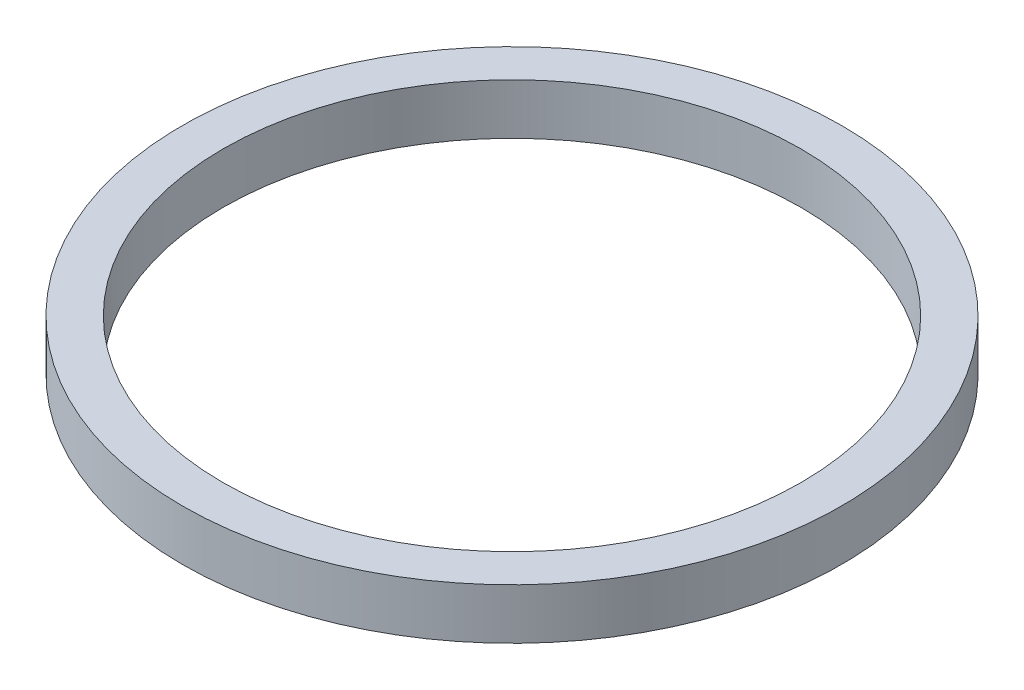
ISO-10303-21;
HEADER;
FILE_DESCRIPTION(('STEP AP214'),'2;1');
FILE_NAME('part.step','',(''),(''),'','','');
FILE_SCHEMA(('AUTOMOTIVE_DESIGN { 1 0 10303 214 1 1 1 1 }'));
ENDSEC;
DATA;
#1=APPLICATION_CONTEXT('core data for automotive mechanical design processes');
#2=APPLICATION_PROTOCOL_DEFINITION('international standard','automotive_design',2000,#1);
#3=PRODUCT_CONTEXT('',#1,'mechanical');
#4=PRODUCT('Part','Part','',(#3));
#5=PRODUCT_RELATED_PRODUCT_CATEGORY('part','',(#4));
#6=PRODUCT_DEFINITION_FORMATION('','',#4);
#7=PRODUCT_DEFINITION_CONTEXT('part definition',#1,'design');
#8=PRODUCT_DEFINITION('design','',#6,#7);
#9=PRODUCT_DEFINITION_SHAPE('','',#8);
#10=(LENGTH_UNIT() NAMED_UNIT(*) SI_UNIT(.MILLI.,.METRE.));
#11=(NAMED_UNIT(*) PLANE_ANGLE_UNIT() SI_UNIT($,.RADIAN.));
#12=(NAMED_UNIT(*) SI_UNIT($,.STERADIAN.) SOLID_ANGLE_UNIT());
#13=UNCERTAINTY_MEASURE_WITH_UNIT(LENGTH_MEASURE(1.E-05),#10,'distance_accuracy_value','');
#14=(GEOMETRIC_REPRESENTATION_CONTEXT(3) GLOBAL_UNCERTAINTY_ASSIGNED_CONTEXT((#13)) GLOBAL_UNIT_ASSIGNED_CONTEXT((#10,
#11,#12)) REPRESENTATION_CONTEXT('',''));
#15=CARTESIAN_POINT('',(0.,0.,0.));
#16=DIRECTION('',(0.,0.,1.));
#17=DIRECTION('',(1.,0.,0.));
#18=AXIS2_PLACEMENT_3D('',#15,#16,#17);
#19=CARTESIAN_POINT('',(0.,3.175,0.));
#20=DIRECTION('',(0.,1.,0.));
#21=DIRECTION('',(0.,0.,1.));
#22=AXIS2_PLACEMENT_3D('',#19,#20,#21);
#23=PLANE('',#22);
#24=CARTESIAN_POINT('',(0.,3.175,0.));
#25=DIRECTION('',(0.,1.,0.));
#26=DIRECTION('',(0.,0.,1.));
#27=AXIS2_PLACEMENT_3D('',#24,#25,#26);
#28=CIRCLE('',#27,20.6375);
#29=CARTESIAN_POINT('',(0.,3.175,20.6375));
#30=VERTEX_POINT('',#29);
#31=EDGE_CURVE('E10',#30,#30,#28,.T.);
#32=ORIENTED_EDGE('',*,*,#31,.T.);
#33=EDGE_LOOP('',(#32));
#34=FACE_BOUND('',#33,.T.);
#35=CARTESIAN_POINT('',(0.,3.175,0.));
#36=DIRECTION('',(0.,1.,0.));
#37=DIRECTION('',(0.,0.,1.));
#38=AXIS2_PLACEMENT_3D('',#35,#36,#37);
#39=CIRCLE('',#38,18.0975);
#40=CARTESIAN_POINT('',(0.,3.175,18.0975));
#41=VERTEX_POINT('',#40);
#42=EDGE_CURVE('E46',#41,#41,#39,.T.);
#43=ORIENTED_EDGE('',*,*,#42,.F.);
#44=EDGE_LOOP('',(#43));
#45=FACE_BOUND('',#44,.T.);
#46=ADVANCED_FACE('F35',(#34,#45),#23,.T.);
#47=CARTESIAN_POINT('',(0.,0.,0.));
#48=DIRECTION('',(0.,1.,0.));
#49=DIRECTION('',(0.,0.,1.));
#50=AXIS2_PLACEMENT_3D('',#47,#48,#49);
#51=PLANE('',#50);
#52=CARTESIAN_POINT('',(0.,0.,0.));
#53=DIRECTION('',(0.,1.,0.));
#54=DIRECTION('',(0.,0.,1.));
#55=AXIS2_PLACEMENT_3D('',#52,#53,#54);
#56=CIRCLE('',#55,20.6375);
#57=CARTESIAN_POINT('',(0.,0.,20.6375));
#58=VERTEX_POINT('',#57);
#59=EDGE_CURVE('E39',#58,#58,#56,.T.);
#60=ORIENTED_EDGE('',*,*,#59,.F.);
#61=EDGE_LOOP('',(#60));
#62=FACE_BOUND('',#61,.T.);
#63=CARTESIAN_POINT('',(0.,0.,0.));
#64=DIRECTION('',(0.,1.,0.));
#65=DIRECTION('',(0.,0.,1.));
#66=AXIS2_PLACEMENT_3D('',#63,#64,#65);
#67=CIRCLE('',#66,18.0975);
#68=CARTESIAN_POINT('',(0.,0.,18.0975));
#69=VERTEX_POINT('',#68);
#70=EDGE_CURVE('E48',#69,#69,#67,.T.);
#71=ORIENTED_EDGE('',*,*,#70,.T.);
#72=EDGE_LOOP('',(#71));
#73=FACE_BOUND('',#72,.T.);
#74=ADVANCED_FACE('F58',(#62,#73),#51,.F.);
#75=CARTESIAN_POINT('',(0.,3.175,0.));
#76=DIRECTION('',(0.,-1.,0.));
#77=DIRECTION('',(0.,0.,-1.));
#78=AXIS2_PLACEMENT_3D('',#75,#76,#77);
#79=CYLINDRICAL_SURFACE('',#78,20.6375);
#80=ORIENTED_EDGE('',*,*,#31,.F.);
#81=EDGE_LOOP('',(#80));
#82=FACE_BOUND('',#81,.T.);
#83=ORIENTED_EDGE('',*,*,#59,.T.);
#84=EDGE_LOOP('',(#83));
#85=FACE_BOUND('',#84,.T.);
#86=ADVANCED_FACE('F37',(#82,#85),#79,.T.);
#87=CARTESIAN_POINT('',(0.,3.175,0.));
#88=DIRECTION('',(0.,-1.,0.));
#89=DIRECTION('',(0.,0.,-1.));
#90=AXIS2_PLACEMENT_3D('',#87,#88,#89);
#91=CYLINDRICAL_SURFACE('',#90,18.0975);
#92=ORIENTED_EDGE('',*,*,#42,.T.);
#93=EDGE_LOOP('',(#92));
#94=FACE_BOUND('',#93,.T.);
#95=ORIENTED_EDGE('',*,*,#70,.F.);
#96=EDGE_LOOP('',(#95));
#97=FACE_BOUND('',#96,.T.);
#98=ADVANCED_FACE('F54',(#94,#97),#91,.F.);
#99=CLOSED_SHELL('',(#46,#74,#86,#98));
#100=MANIFOLD_SOLID_BREP('B2',#99);
#101=ADVANCED_BREP_SHAPE_REPRESENTATION('',(#18,#100),#14);
#102=SHAPE_DEFINITION_REPRESENTATION(#9,#101);
ENDSEC;
END-ISO-10303-21;
